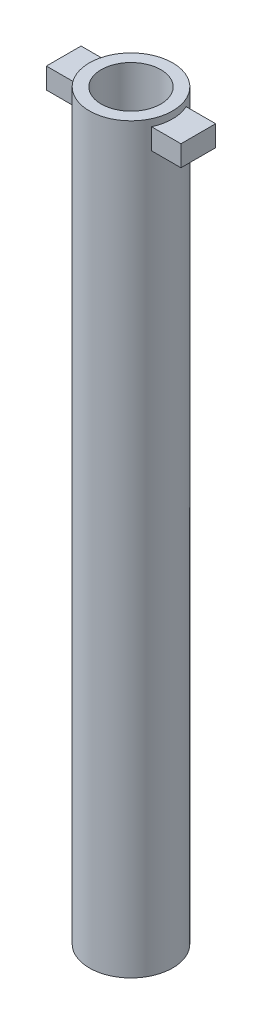
ISO-10303-21;
HEADER;
FILE_DESCRIPTION(('STEP AP214'),'2;1');
FILE_NAME('part.step','',(''),(''),'','','');
FILE_SCHEMA(('AUTOMOTIVE_DESIGN { 1 0 10303 214 1 1 1 1 }'));
ENDSEC;
DATA;
#1=APPLICATION_CONTEXT('core data for automotive mechanical design processes');
#2=APPLICATION_PROTOCOL_DEFINITION('international standard','automotive_design',2000,#1);
#3=PRODUCT_CONTEXT('',#1,'mechanical');
#4=PRODUCT('Part','Part','',(#3));
#5=PRODUCT_RELATED_PRODUCT_CATEGORY('part','',(#4));
#6=PRODUCT_DEFINITION_FORMATION('','',#4);
#7=PRODUCT_DEFINITION_CONTEXT('part definition',#1,'design');
#8=PRODUCT_DEFINITION('design','',#6,#7);
#9=PRODUCT_DEFINITION_SHAPE('','',#8);
#10=(LENGTH_UNIT() NAMED_UNIT(*) SI_UNIT(.MILLI.,.METRE.));
#11=(NAMED_UNIT(*) PLANE_ANGLE_UNIT() SI_UNIT($,.RADIAN.));
#12=(NAMED_UNIT(*) SI_UNIT($,.STERADIAN.) SOLID_ANGLE_UNIT());
#13=UNCERTAINTY_MEASURE_WITH_UNIT(LENGTH_MEASURE(1.E-05),#10,'distance_accuracy_value','');
#14=(GEOMETRIC_REPRESENTATION_CONTEXT(3) GLOBAL_UNCERTAINTY_ASSIGNED_CONTEXT((#13)) GLOBAL_UNIT_ASSIGNED_CONTEXT((#10,
#11,#12)) REPRESENTATION_CONTEXT('',''));
#15=CARTESIAN_POINT('',(0.,0.,0.));
#16=DIRECTION('',(0.,0.,1.));
#17=DIRECTION('',(1.,0.,0.));
#18=AXIS2_PLACEMENT_3D('',#15,#16,#17);
#19=CARTESIAN_POINT('',(0.,0.,0.));
#20=DIRECTION('',(0.,-1.,0.));
#21=DIRECTION('',(0.,0.,-1.));
#22=AXIS2_PLACEMENT_3D('',#19,#20,#21);
#23=PLANE('',#22);
#24=CARTESIAN_POINT('',(0.,0.,0.));
#25=DIRECTION('',(0.,-1.,0.));
#26=DIRECTION('',(0.,0.,-1.));
#27=AXIS2_PLACEMENT_3D('',#24,#25,#26);
#28=CIRCLE('',#27,6.);
#29=CARTESIAN_POINT('',(0.,0.,-6.));
#30=VERTEX_POINT('',#29);
#31=EDGE_CURVE('E131',#30,#30,#28,.T.);
#32=ORIENTED_EDGE('',*,*,#31,.T.);
#33=EDGE_LOOP('',(#32));
#34=FACE_BOUND('',#33,.T.);
#35=ADVANCED_FACE('F39',(#34),#23,.T.);
#36=CARTESIAN_POINT('',(0.,0.,0.));
#37=DIRECTION('',(0.,-1.,0.));
#38=DIRECTION('',(0.,0.,-1.));
#39=AXIS2_PLACEMENT_3D('',#36,#37,#38);
#40=CYLINDRICAL_SURFACE('',#39,6.);
#41=DIRECTION('',(0.,-1.,0.));
#42=VECTOR('',#41,1.);
#43=CARTESIAN_POINT('',(-5.45435605731786,0.,2.5));
#44=LINE('',#43,#42);
#45=CARTESIAN_POINT('',(-5.45435605731786,103.,2.5));
#46=VERTEX_POINT('',#45);
#47=CARTESIAN_POINT('',(-5.45435605731786,106.,2.5));
#48=VERTEX_POINT('',#47);
#49=EDGE_CURVE('E11',#46,#48,#44,.F.);
#50=ORIENTED_EDGE('',*,*,#49,.F.);
#51=CARTESIAN_POINT('',(0.,103.,0.));
#52=DIRECTION('',(0.,1.,0.));
#53=DIRECTION('',(0.,0.,1.));
#54=AXIS2_PLACEMENT_3D('',#51,#52,#53);
#55=CIRCLE('',#54,6.);
#56=CARTESIAN_POINT('',(-5.45435605731786,103.,-2.5));
#57=VERTEX_POINT('',#56);
#58=EDGE_CURVE('E46',#46,#57,#55,.F.);
#59=ORIENTED_EDGE('',*,*,#58,.T.);
#60=DIRECTION('',(0.,-1.,0.));
#61=VECTOR('',#60,1.);
#62=CARTESIAN_POINT('',(-5.45435605731786,0.,-2.5));
#63=LINE('',#62,#61);
#64=CARTESIAN_POINT('',(-5.45435605731786,106.,-2.5));
#65=VERTEX_POINT('',#64);
#66=EDGE_CURVE('E151',#57,#65,#63,.F.);
#67=ORIENTED_EDGE('',*,*,#66,.T.);
#68=CARTESIAN_POINT('',(0.,106.,0.));
#69=DIRECTION('',(0.,-1.,0.));
#70=DIRECTION('',(0.,0.,-1.));
#71=AXIS2_PLACEMENT_3D('',#68,#69,#70);
#72=CIRCLE('',#71,6.);
#73=EDGE_CURVE('E147',#65,#48,#72,.F.);
#74=ORIENTED_EDGE('',*,*,#73,.T.);
#75=EDGE_LOOP('',(#50,#59,#67,#74));
#76=FACE_BOUND('',#75,.T.);
#77=DIRECTION('',(0.,-1.,0.));
#78=VECTOR('',#77,1.);
#79=CARTESIAN_POINT('',(5.45435605731786,0.,2.5));
#80=LINE('',#79,#78);
#81=CARTESIAN_POINT('',(5.45435605731786,106.,2.5));
#82=VERTEX_POINT('',#81);
#83=CARTESIAN_POINT('',(5.45435605731786,103.,2.5));
#84=VERTEX_POINT('',#83);
#85=EDGE_CURVE('E150',#82,#84,#80,.T.);
#86=ORIENTED_EDGE('',*,*,#85,.F.);
#87=CARTESIAN_POINT('',(5.45435605731786,106.,-2.5));
#88=VERTEX_POINT('',#87);
#89=EDGE_CURVE('E143',#82,#88,#72,.F.);
#90=ORIENTED_EDGE('',*,*,#89,.T.);
#91=DIRECTION('',(0.,-1.,0.));
#92=VECTOR('',#91,1.);
#93=CARTESIAN_POINT('',(5.45435605731786,0.,-2.5));
#94=LINE('',#93,#92);
#95=CARTESIAN_POINT('',(5.45435605731786,103.,-2.5));
#96=VERTEX_POINT('',#95);
#97=EDGE_CURVE('E140',#88,#96,#94,.T.);
#98=ORIENTED_EDGE('',*,*,#97,.T.);
#99=EDGE_CURVE('E146',#96,#84,#55,.F.);
#100=ORIENTED_EDGE('',*,*,#99,.T.);
#101=EDGE_LOOP('',(#86,#90,#98,#100));
#102=FACE_BOUND('',#101,.T.);
#103=CARTESIAN_POINT('',(0.,107.,0.));
#104=DIRECTION('',(0.,-1.,0.));
#105=DIRECTION('',(0.,0.,-1.));
#106=AXIS2_PLACEMENT_3D('',#103,#104,#105);
#107=CIRCLE('',#106,6.);
#108=CARTESIAN_POINT('',(0.,107.,-6.));
#109=VERTEX_POINT('',#108);
#110=EDGE_CURVE('E127',#109,#109,#107,.T.);
#111=ORIENTED_EDGE('',*,*,#110,.T.);
#112=EDGE_LOOP('',(#111));
#113=FACE_BOUND('',#112,.T.);
#114=ORIENTED_EDGE('',*,*,#31,.F.);
#115=EDGE_LOOP('',(#114));
#116=FACE_BOUND('',#115,.T.);
#117=ADVANCED_FACE('F155',(#76,#102,#113,#116),#40,.T.);
#118=CARTESIAN_POINT('',(6.,107.,0.));
#119=DIRECTION('',(0.,1.,0.));
#120=DIRECTION('',(0.,0.,1.));
#121=AXIS2_PLACEMENT_3D('',#118,#119,#120);
#122=PLANE('',#121);
#123=CARTESIAN_POINT('',(0.,107.,0.));
#124=DIRECTION('',(0.,1.,0.));
#125=DIRECTION('',(0.,0.,1.));
#126=AXIS2_PLACEMENT_3D('',#123,#124,#125);
#127=CIRCLE('',#126,4.3);
#128=CARTESIAN_POINT('',(0.,107.,4.3));
#129=VERTEX_POINT('',#128);
#130=EDGE_CURVE('E192',#129,#129,#127,.T.);
#131=ORIENTED_EDGE('',*,*,#130,.F.);
#132=EDGE_LOOP('',(#131));
#133=FACE_BOUND('',#132,.T.);
#134=ORIENTED_EDGE('',*,*,#110,.F.);
#135=EDGE_LOOP('',(#134));
#136=FACE_BOUND('',#135,.T.);
#137=ADVANCED_FACE('F206',(#133,#136),#122,.T.);
#138=CARTESIAN_POINT('',(9.7,103.,2.5));
#139=DIRECTION('',(-1.,0.,0.));
#140=DIRECTION('',(0.,0.,1.));
#141=AXIS2_PLACEMENT_3D('',#138,#139,#140);
#142=PLANE('',#141);
#143=DIRECTION('',(0.,1.,0.));
#144=VECTOR('',#143,1.);
#145=CARTESIAN_POINT('',(9.7,103.,-2.5));
#146=LINE('',#145,#144);
#147=CARTESIAN_POINT('',(9.7,103.,-2.5));
#148=VERTEX_POINT('',#147);
#149=CARTESIAN_POINT('',(9.7,106.,-2.5));
#150=VERTEX_POINT('',#149);
#151=EDGE_CURVE('E169',#148,#150,#146,.T.);
#152=ORIENTED_EDGE('',*,*,#151,.T.);
#153=DIRECTION('',(0.,0.,-1.));
#154=VECTOR('',#153,1.);
#155=CARTESIAN_POINT('',(9.7,106.,2.5));
#156=LINE('',#155,#154);
#157=CARTESIAN_POINT('',(9.7,106.,2.5));
#158=VERTEX_POINT('',#157);
#159=EDGE_CURVE('E134',#158,#150,#156,.T.);
#160=ORIENTED_EDGE('',*,*,#159,.F.);
#161=DIRECTION('',(0.,1.,0.));
#162=VECTOR('',#161,1.);
#163=CARTESIAN_POINT('',(9.7,103.,2.5));
#164=LINE('',#163,#162);
#165=CARTESIAN_POINT('',(9.7,103.,2.5));
#166=VERTEX_POINT('',#165);
#167=EDGE_CURVE('E112',#166,#158,#164,.T.);
#168=ORIENTED_EDGE('',*,*,#167,.F.);
#169=DIRECTION('',(0.,0.,-1.));
#170=VECTOR('',#169,1.);
#171=CARTESIAN_POINT('',(9.7,103.,2.5));
#172=LINE('',#171,#170);
#173=EDGE_CURVE('E128',#166,#148,#172,.T.);
#174=ORIENTED_EDGE('',*,*,#173,.T.);
#175=EDGE_LOOP('',(#152,#160,#168,#174));
#176=FACE_BOUND('',#175,.T.);
#177=ADVANCED_FACE('F188',(#176),#142,.F.);
#178=CARTESIAN_POINT('',(0.,0.,-2.5));
#179=DIRECTION('',(0.,0.,1.));
#180=DIRECTION('',(1.,0.,0.));
#181=AXIS2_PLACEMENT_3D('',#178,#179,#180);
#182=PLANE('',#181);
#183=ORIENTED_EDGE('',*,*,#97,.F.);
#184=DIRECTION('',(-1.,0.,0.));
#185=VECTOR('',#184,1.);
#186=CARTESIAN_POINT('',(9.7,106.,-2.5));
#187=LINE('',#186,#185);
#188=EDGE_CURVE('E123',#150,#88,#187,.T.);
#189=ORIENTED_EDGE('',*,*,#188,.F.);
#190=ORIENTED_EDGE('',*,*,#151,.F.);
#191=DIRECTION('',(1.,0.,0.));
#192=VECTOR('',#191,1.);
#193=CARTESIAN_POINT('',(-9.7,103.,-2.5));
#194=LINE('',#193,#192);
#195=EDGE_CURVE('E61',#96,#148,#194,.T.);
#196=ORIENTED_EDGE('',*,*,#195,.F.);
#197=EDGE_LOOP('',(#183,#189,#190,#196));
#198=FACE_BOUND('',#197,.T.);
#199=ADVANCED_FACE('F181',(#198),#182,.F.);
#200=CARTESIAN_POINT('',(0.,0.,2.5));
#201=DIRECTION('',(0.,0.,1.));
#202=DIRECTION('',(1.,0.,0.));
#203=AXIS2_PLACEMENT_3D('',#200,#201,#202);
#204=PLANE('',#203);
#205=DIRECTION('',(-1.,0.,0.));
#206=VECTOR('',#205,1.);
#207=CARTESIAN_POINT('',(9.7,106.,2.5));
#208=LINE('',#207,#206);
#209=EDGE_CURVE('E160',#158,#82,#208,.T.);
#210=ORIENTED_EDGE('',*,*,#209,.T.);
#211=ORIENTED_EDGE('',*,*,#85,.T.);
#212=DIRECTION('',(1.,0.,0.));
#213=VECTOR('',#212,1.);
#214=CARTESIAN_POINT('',(-9.7,103.,2.5));
#215=LINE('',#214,#213);
#216=EDGE_CURVE('E113',#84,#166,#215,.T.);
#217=ORIENTED_EDGE('',*,*,#216,.T.);
#218=ORIENTED_EDGE('',*,*,#167,.T.);
#219=EDGE_LOOP('',(#210,#211,#217,#218));
#220=FACE_BOUND('',#219,.T.);
#221=ADVANCED_FACE('F185',(#220),#204,.T.);
#222=CARTESIAN_POINT('',(9.7,106.,2.5));
#223=DIRECTION('',(0.,-1.,0.));
#224=DIRECTION('',(0.,0.,-1.));
#225=AXIS2_PLACEMENT_3D('',#222,#223,#224);
#226=PLANE('',#225);
#227=ORIENTED_EDGE('',*,*,#89,.F.);
#228=ORIENTED_EDGE('',*,*,#209,.F.);
#229=ORIENTED_EDGE('',*,*,#159,.T.);
#230=ORIENTED_EDGE('',*,*,#188,.T.);
#231=EDGE_LOOP('',(#227,#228,#229,#230));
#232=FACE_BOUND('',#231,.T.);
#233=ADVANCED_FACE('F178',(#232),#226,.F.);
#234=CARTESIAN_POINT('',(-9.7,103.,2.5));
#235=DIRECTION('',(0.,1.,0.));
#236=DIRECTION('',(0.,0.,1.));
#237=AXIS2_PLACEMENT_3D('',#234,#235,#236);
#238=PLANE('',#237);
#239=ORIENTED_EDGE('',*,*,#99,.F.);
#240=ORIENTED_EDGE('',*,*,#195,.T.);
#241=ORIENTED_EDGE('',*,*,#173,.F.);
#242=ORIENTED_EDGE('',*,*,#216,.F.);
#243=EDGE_LOOP('',(#239,#240,#241,#242));
#244=FACE_BOUND('',#243,.T.);
#245=ADVANCED_FACE('F190',(#244),#238,.F.);
#246=ORIENTED_EDGE('',*,*,#58,.F.);
#247=CARTESIAN_POINT('',(-9.7,103.,2.5));
#248=VERTEX_POINT('',#247);
#249=EDGE_CURVE('E102',#248,#46,#215,.T.);
#250=ORIENTED_EDGE('',*,*,#249,.F.);
#251=DIRECTION('',(0.,0.,-1.));
#252=VECTOR('',#251,1.);
#253=CARTESIAN_POINT('',(-9.7,103.,2.5));
#254=LINE('',#253,#252);
#255=CARTESIAN_POINT('',(-9.7,103.,-2.5));
#256=VERTEX_POINT('',#255);
#257=EDGE_CURVE('E107',#248,#256,#254,.T.);
#258=ORIENTED_EDGE('',*,*,#257,.T.);
#259=EDGE_CURVE('E167',#256,#57,#194,.T.);
#260=ORIENTED_EDGE('',*,*,#259,.T.);
#261=EDGE_LOOP('',(#246,#250,#258,#260));
#262=FACE_BOUND('',#261,.T.);
#263=ADVANCED_FACE('F104',(#262),#238,.F.);
#264=ORIENTED_EDGE('',*,*,#73,.F.);
#265=CARTESIAN_POINT('',(-9.7,106.,-2.5));
#266=VERTEX_POINT('',#265);
#267=EDGE_CURVE('E53',#65,#266,#187,.T.);
#268=ORIENTED_EDGE('',*,*,#267,.T.);
#269=DIRECTION('',(0.,0.,-1.));
#270=VECTOR('',#269,1.);
#271=CARTESIAN_POINT('',(-9.7,106.,2.5));
#272=LINE('',#271,#270);
#273=CARTESIAN_POINT('',(-9.7,106.,2.5));
#274=VERTEX_POINT('',#273);
#275=EDGE_CURVE('E159',#274,#266,#272,.T.);
#276=ORIENTED_EDGE('',*,*,#275,.F.);
#277=EDGE_CURVE('E119',#48,#274,#208,.T.);
#278=ORIENTED_EDGE('',*,*,#277,.F.);
#279=EDGE_LOOP('',(#264,#268,#276,#278));
#280=FACE_BOUND('',#279,.T.);
#281=ADVANCED_FACE('F158',(#280),#226,.F.);
#282=ORIENTED_EDGE('',*,*,#249,.T.);
#283=ORIENTED_EDGE('',*,*,#49,.T.);
#284=ORIENTED_EDGE('',*,*,#277,.T.);
#285=DIRECTION('',(0.,-1.,0.));
#286=VECTOR('',#285,1.);
#287=CARTESIAN_POINT('',(-9.7,106.,2.5));
#288=LINE('',#287,#286);
#289=EDGE_CURVE('E116',#274,#248,#288,.T.);
#290=ORIENTED_EDGE('',*,*,#289,.T.);
#291=EDGE_LOOP('',(#282,#283,#284,#290));
#292=FACE_BOUND('',#291,.T.);
#293=ADVANCED_FACE('F117',(#292),#204,.T.);
#294=ORIENTED_EDGE('',*,*,#66,.F.);
#295=ORIENTED_EDGE('',*,*,#259,.F.);
#296=DIRECTION('',(0.,-1.,0.));
#297=VECTOR('',#296,1.);
#298=CARTESIAN_POINT('',(-9.7,106.,-2.5));
#299=LINE('',#298,#297);
#300=EDGE_CURVE('E126',#266,#256,#299,.T.);
#301=ORIENTED_EDGE('',*,*,#300,.F.);
#302=ORIENTED_EDGE('',*,*,#267,.F.);
#303=EDGE_LOOP('',(#294,#295,#301,#302));
#304=FACE_BOUND('',#303,.T.);
#305=ADVANCED_FACE('F241',(#304),#182,.F.);
#306=CARTESIAN_POINT('',(-9.7,106.,2.5));
#307=DIRECTION('',(1.,0.,0.));
#308=DIRECTION('',(0.,0.,-1.));
#309=AXIS2_PLACEMENT_3D('',#306,#307,#308);
#310=PLANE('',#309);
#311=ORIENTED_EDGE('',*,*,#300,.T.);
#312=ORIENTED_EDGE('',*,*,#257,.F.);
#313=ORIENTED_EDGE('',*,*,#289,.F.);
#314=ORIENTED_EDGE('',*,*,#275,.T.);
#315=EDGE_LOOP('',(#311,#312,#313,#314));
#316=FACE_BOUND('',#315,.T.);
#317=ADVANCED_FACE('F125',(#316),#310,.F.);
#318=CARTESIAN_POINT('',(0.,55.,0.));
#319=DIRECTION('',(0.,1.,0.));
#320=DIRECTION('',(0.,0.,1.));
#321=AXIS2_PLACEMENT_3D('',#318,#319,#320);
#322=CYLINDRICAL_SURFACE('',#321,4.3);
#323=CARTESIAN_POINT('',(0.,55.,0.));
#324=DIRECTION('',(0.,1.,0.));
#325=DIRECTION('',(0.,0.,1.));
#326=AXIS2_PLACEMENT_3D('',#323,#324,#325);
#327=CIRCLE('',#326,4.3);
#328=CARTESIAN_POINT('',(0.,55.,4.3));
#329=VERTEX_POINT('',#328);
#330=EDGE_CURVE('E166',#329,#329,#327,.T.);
#331=CARTESIAN_POINT('',(0.,55.,4.3));
#332=CARTESIAN_POINT('',(0.,55.5416666666667,4.3));
#333=CARTESIAN_POINT('',(0.,56.0833333333333,4.3));
#334=CARTESIAN_POINT('',(0.,57.1666666666667,4.3));
#335=CARTESIAN_POINT('',(0.,57.7083333333333,4.3));
#336=CARTESIAN_POINT('',(0.,58.7916666666667,4.3));
#337=CARTESIAN_POINT('',(0.,59.3333333333333,4.3));
#338=CARTESIAN_POINT('',(0.,60.4166666666667,4.3));
#339=CARTESIAN_POINT('',(0.,60.9583333333333,4.3));
#340=CARTESIAN_POINT('',(0.,62.0416666666667,4.3));
#341=CARTESIAN_POINT('',(0.,62.5833333333333,4.3));
#342=CARTESIAN_POINT('',(0.,63.6666666666667,4.3));
#343=CARTESIAN_POINT('',(0.,64.2083333333333,4.3));
#344=CARTESIAN_POINT('',(0.,65.2916666666667,4.3));
#345=CARTESIAN_POINT('',(0.,65.8333333333333,4.3));
#346=CARTESIAN_POINT('',(0.,66.9166666666667,4.3));
#347=CARTESIAN_POINT('',(0.,67.4583333333333,4.3));
#348=CARTESIAN_POINT('',(0.,68.5416666666667,4.3));
#349=CARTESIAN_POINT('',(0.,69.0833333333333,4.3));
#350=CARTESIAN_POINT('',(0.,70.1666666666667,4.3));
#351=CARTESIAN_POINT('',(0.,70.7083333333333,4.3));
#352=CARTESIAN_POINT('',(0.,71.7916666666667,4.3));
#353=CARTESIAN_POINT('',(0.,72.3333333333333,4.3));
#354=CARTESIAN_POINT('',(0.,73.4166666666667,4.3));
#355=CARTESIAN_POINT('',(0.,73.9583333333333,4.3));
#356=CARTESIAN_POINT('',(0.,75.0416666666667,4.3));
#357=CARTESIAN_POINT('',(0.,75.5833333333333,4.3));
#358=CARTESIAN_POINT('',(0.,76.6666666666667,4.3));
#359=CARTESIAN_POINT('',(0.,77.2083333333333,4.3));
#360=CARTESIAN_POINT('',(0.,78.2916666666667,4.3));
#361=CARTESIAN_POINT('',(0.,78.8333333333333,4.3));
#362=CARTESIAN_POINT('',(0.,79.9166666666667,4.3));
#363=CARTESIAN_POINT('',(0.,80.4583333333333,4.3));
#364=CARTESIAN_POINT('',(0.,81.5416666666667,4.3));
#365=CARTESIAN_POINT('',(0.,82.0833333333333,4.3));
#366=CARTESIAN_POINT('',(0.,83.1666666666667,4.3));
#367=CARTESIAN_POINT('',(0.,83.7083333333333,4.3));
#368=CARTESIAN_POINT('',(0.,84.7916666666667,4.3));
#369=CARTESIAN_POINT('',(0.,85.3333333333333,4.3));
#370=CARTESIAN_POINT('',(0.,86.4166666666667,4.3));
#371=CARTESIAN_POINT('',(0.,86.9583333333333,4.3));
#372=CARTESIAN_POINT('',(0.,88.0416666666667,4.3));
#373=CARTESIAN_POINT('',(0.,88.5833333333333,4.3));
#374=CARTESIAN_POINT('',(0.,89.6666666666667,4.3));
#375=CARTESIAN_POINT('',(0.,90.2083333333333,4.3));
#376=CARTESIAN_POINT('',(0.,91.2916666666667,4.3));
#377=CARTESIAN_POINT('',(0.,91.8333333333333,4.3));
#378=CARTESIAN_POINT('',(0.,92.9166666666667,4.3));
#379=CARTESIAN_POINT('',(0.,93.4583333333333,4.3));
#380=CARTESIAN_POINT('',(0.,94.5416666666667,4.3));
#381=CARTESIAN_POINT('',(0.,95.0833333333333,4.3));
#382=CARTESIAN_POINT('',(0.,96.1666666666667,4.3));
#383=CARTESIAN_POINT('',(0.,96.7083333333333,4.3));
#384=CARTESIAN_POINT('',(0.,97.7916666666667,4.3));
#385=CARTESIAN_POINT('',(0.,98.3333333333333,4.3));
#386=CARTESIAN_POINT('',(0.,99.4166666666667,4.3));
#387=CARTESIAN_POINT('',(0.,99.9583333333333,4.3));
#388=CARTESIAN_POINT('',(0.,101.041666666667,4.3));
#389=CARTESIAN_POINT('',(0.,101.583333333333,4.3));
#390=CARTESIAN_POINT('',(0.,102.666666666667,4.3));
#391=CARTESIAN_POINT('',(0.,103.208333333333,4.3));
#392=CARTESIAN_POINT('',(0.,104.291666666667,4.3));
#393=CARTESIAN_POINT('',(0.,104.833333333333,4.3));
#394=CARTESIAN_POINT('',(0.,105.916666666667,4.3));
#395=CARTESIAN_POINT('',(0.,106.458333333333,4.3));
#396=CARTESIAN_POINT('',(0.,107.,4.3));
#397=B_SPLINE_CURVE_WITH_KNOTS('',3,(#331,#332,#333,#334,#335,#336,#337,#338,#339,#340,#341,
#342,#343,#344,#345,#346,#347,#348,#349,#350,#351,#352,#353,#354,#355,#356,#357,#358,#359,#360,
#361,#362,#363,#364,#365,#366,#367,#368,#369,#370,#371,#372,#373,#374,#375,#376,#377,#378,#379,
#380,#381,#382,#383,#384,#385,#386,#387,#388,#389,#390,#391,#392,#393,#394,#395,#396),
.UNSPECIFIED.,.F.,.F.,(4,2,2,2,2,2,2,2,2,2,2,2,2,2,2,2,2,2,2,2,2,2,2,2,2,2,2,2,2,2,2,2,4),(0.,
1.625,3.25,4.875,6.50000000000001,8.12500000000001,9.75000000000001,11.375,13.,14.625,16.25,
17.875,19.5,21.125,22.75,24.375,26.,27.625,29.25,30.875,32.5,34.125,35.75,37.375,39.,40.625,
42.25,43.875,45.5,47.125,48.75,50.375,52.),.UNSPECIFIED.);
#398=EDGE_CURVE('BSEAM200',#329,#129,#397,.T.);
#399=ORIENTED_EDGE('',*,*,#330,.F.);
#400=ORIENTED_EDGE('',*,*,#130,.T.);
#401=ORIENTED_EDGE('',*,*,#398,.T.);
#402=ORIENTED_EDGE('',*,*,#398,.F.);
#403=EDGE_LOOP('',(#399,#401,#400,#402));
#404=FACE_BOUND('',#403,.T.);
#405=ADVANCED_FACE('F200',(#404),#322,.F.);
#406=CARTESIAN_POINT('',(0.,55.,0.));
#407=DIRECTION('',(0.,1.,0.));
#408=DIRECTION('',(0.,0.,1.));
#409=AXIS2_PLACEMENT_3D('',#406,#407,#408);
#410=PLANE('',#409);
#411=ORIENTED_EDGE('',*,*,#330,.T.);
#412=EDGE_LOOP('',(#411));
#413=FACE_BOUND('',#412,.T.);
#414=ADVANCED_FACE('F198',(#413),#410,.T.);
#415=CLOSED_SHELL('',(#35,#117,#137,#177,#199,#221,#233,#245,#263,#281,#293,#305,#317,#405,#414));
#416=MANIFOLD_SOLID_BREP('B2',#415);
#417=ADVANCED_BREP_SHAPE_REPRESENTATION('',(#18,#416),#14);
#418=SHAPE_DEFINITION_REPRESENTATION(#9,#417);
ENDSEC;
END-ISO-10303-21;
